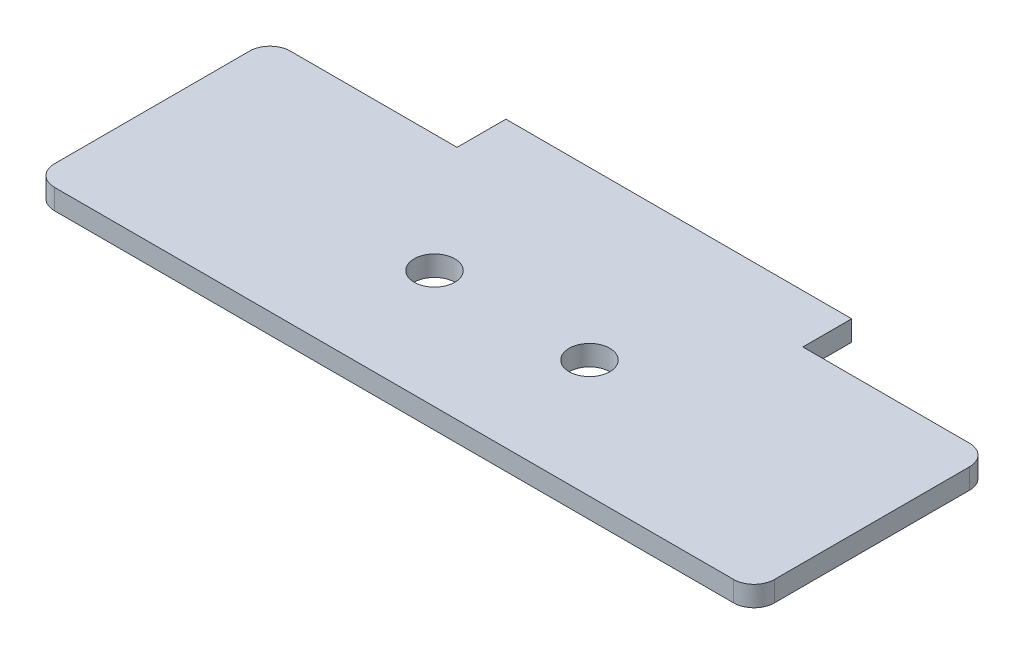
ISO-10303-21;
HEADER;
FILE_DESCRIPTION(('STEP AP214'),'2;1');
FILE_NAME('part.step','',(''),(''),'','','');
FILE_SCHEMA(('AUTOMOTIVE_DESIGN { 1 0 10303 214 1 1 1 1 }'));
ENDSEC;
DATA;
#1=APPLICATION_CONTEXT('core data for automotive mechanical design processes');
#2=APPLICATION_PROTOCOL_DEFINITION('international standard','automotive_design',2000,#1);
#3=PRODUCT_CONTEXT('',#1,'mechanical');
#4=PRODUCT('Part','Part','',(#3));
#5=PRODUCT_RELATED_PRODUCT_CATEGORY('part','',(#4));
#6=PRODUCT_DEFINITION_FORMATION('','',#4);
#7=PRODUCT_DEFINITION_CONTEXT('part definition',#1,'design');
#8=PRODUCT_DEFINITION('design','',#6,#7);
#9=PRODUCT_DEFINITION_SHAPE('','',#8);
#10=(LENGTH_UNIT() NAMED_UNIT(*) SI_UNIT(.MILLI.,.METRE.));
#11=(NAMED_UNIT(*) PLANE_ANGLE_UNIT() SI_UNIT($,.RADIAN.));
#12=(NAMED_UNIT(*) SI_UNIT($,.STERADIAN.) SOLID_ANGLE_UNIT());
#13=UNCERTAINTY_MEASURE_WITH_UNIT(LENGTH_MEASURE(1.E-05),#10,'distance_accuracy_value','');
#14=(GEOMETRIC_REPRESENTATION_CONTEXT(3) GLOBAL_UNCERTAINTY_ASSIGNED_CONTEXT((#13)) GLOBAL_UNIT_ASSIGNED_CONTEXT((#10,
#11,#12)) REPRESENTATION_CONTEXT('',''));
#15=CARTESIAN_POINT('',(0.,0.,0.));
#16=DIRECTION('',(0.,0.,1.));
#17=DIRECTION('',(1.,0.,0.));
#18=AXIS2_PLACEMENT_3D('',#15,#16,#17);
#19=CARTESIAN_POINT('',(-6.44499999999996,0.5,-2.40000000000001));
#20=DIRECTION('',(0.,1.,0.));
#21=DIRECTION('',(0.,0.,1.));
#22=AXIS2_PLACEMENT_3D('',#19,#20,#21);
#23=PLANE('',#22);
#24=CARTESIAN_POINT('',(0.,0.5,0.));
#25=DIRECTION('',(0.,1.,0.));
#26=DIRECTION('',(0.,0.,1.));
#27=AXIS2_PLACEMENT_3D('',#24,#25,#26);
#28=CIRCLE('',#27,0.499999999999999);
#29=CARTESIAN_POINT('',(0.,0.5,0.499999999999985));
#30=VERTEX_POINT('',#29);
#31=EDGE_CURVE('E170',#30,#30,#28,.T.);
#32=ORIENTED_EDGE('',*,*,#31,.F.);
#33=EDGE_LOOP('',(#32));
#34=FACE_BOUND('',#33,.T.);
#35=DIRECTION('',(0.,0.,1.));
#36=VECTOR('',#35,1.);
#37=CARTESIAN_POINT('',(-2.34499999999997,0.5,-4.10000000000001));
#38=LINE('',#37,#36);
#39=CARTESIAN_POINT('',(-2.34499999999997,0.5,-4.10000000000001));
#40=VERTEX_POINT('',#39);
#41=CARTESIAN_POINT('',(-2.34499999999997,0.5,-2.89999999999999));
#42=VERTEX_POINT('',#41);
#43=EDGE_CURVE('E200',#40,#42,#38,.T.);
#44=ORIENTED_EDGE('',*,*,#43,.T.);
#45=DIRECTION('',(-1.,0.,0.));
#46=VECTOR('',#45,1.);
#47=CARTESIAN_POINT('',(-6.44499999999996,0.5,-2.90000000000001));
#48=LINE('',#47,#46);
#49=CARTESIAN_POINT('',(-6.44499999999996,0.5,-2.90000000000001));
#50=VERTEX_POINT('',#49);
#51=EDGE_CURVE('E112',#42,#50,#48,.T.);
#52=ORIENTED_EDGE('',*,*,#51,.T.);
#53=CARTESIAN_POINT('',(-6.44499999999996,0.5,-2.40000000000001));
#54=DIRECTION('',(0.,1.,0.));
#55=DIRECTION('',(0.,0.,1.));
#56=AXIS2_PLACEMENT_3D('',#53,#54,#55);
#57=CIRCLE('',#56,0.5);
#58=CARTESIAN_POINT('',(-6.94499999999996,0.5,-2.40000000000001));
#59=VERTEX_POINT('',#58);
#60=EDGE_CURVE('E237',#50,#59,#57,.T.);
#61=ORIENTED_EDGE('',*,*,#60,.T.);
#62=DIRECTION('',(0.,0.,1.));
#63=VECTOR('',#62,1.);
#64=CARTESIAN_POINT('',(-6.94499999999996,0.5,-2.40000000000001));
#65=LINE('',#64,#63);
#66=CARTESIAN_POINT('',(-6.94499999999996,0.5,2.39999999999998));
#67=VERTEX_POINT('',#66);
#68=EDGE_CURVE('E257',#59,#67,#65,.T.);
#69=ORIENTED_EDGE('',*,*,#68,.T.);
#70=CARTESIAN_POINT('',(-6.44499999999997,0.5,2.39999999999999));
#71=DIRECTION('',(0.,1.,0.));
#72=DIRECTION('',(0.,0.,1.));
#73=AXIS2_PLACEMENT_3D('',#70,#71,#72);
#74=CIRCLE('',#73,0.5);
#75=CARTESIAN_POINT('',(-6.44499999999996,0.5,2.89999999999999));
#76=VERTEX_POINT('',#75);
#77=EDGE_CURVE('E253',#67,#76,#74,.T.);
#78=ORIENTED_EDGE('',*,*,#77,.T.);
#79=DIRECTION('',(1.,0.,0.));
#80=VECTOR('',#79,1.);
#81=CARTESIAN_POINT('',(-6.44499999999996,0.5,2.89999999999999));
#82=LINE('',#81,#80);
#83=CARTESIAN_POINT('',(10.255,0.5,2.89999999999999));
#84=VERTEX_POINT('',#83);
#85=EDGE_CURVE('E256',#76,#84,#82,.T.);
#86=ORIENTED_EDGE('',*,*,#85,.T.);
#87=CARTESIAN_POINT('',(10.255,0.5,2.39999999999999));
#88=DIRECTION('',(0.,1.,0.));
#89=DIRECTION('',(0.,0.,1.));
#90=AXIS2_PLACEMENT_3D('',#87,#88,#89);
#91=CIRCLE('',#90,0.5);
#92=CARTESIAN_POINT('',(10.755,0.5,2.39999999999999));
#93=VERTEX_POINT('',#92);
#94=EDGE_CURVE('E261',#84,#93,#91,.T.);
#95=ORIENTED_EDGE('',*,*,#94,.T.);
#96=DIRECTION('',(0.,0.,-1.));
#97=VECTOR('',#96,1.);
#98=CARTESIAN_POINT('',(10.755,0.5,-2.40000000000001));
#99=LINE('',#98,#97);
#100=CARTESIAN_POINT('',(10.755,0.5,-2.40000000000001));
#101=VERTEX_POINT('',#100);
#102=EDGE_CURVE('E268',#93,#101,#99,.T.);
#103=ORIENTED_EDGE('',*,*,#102,.T.);
#104=CARTESIAN_POINT('',(10.255,0.5,-2.40000000000001));
#105=DIRECTION('',(0.,1.,0.));
#106=DIRECTION('',(0.,0.,-1.));
#107=AXIS2_PLACEMENT_3D('',#104,#105,#106);
#108=CIRCLE('',#107,0.5);
#109=CARTESIAN_POINT('',(10.255,0.5,-2.90000000000001));
#110=VERTEX_POINT('',#109);
#111=EDGE_CURVE('E143',#101,#110,#108,.T.);
#112=ORIENTED_EDGE('',*,*,#111,.T.);
#113=DIRECTION('',(-1.,0.,0.));
#114=VECTOR('',#113,1.);
#115=CARTESIAN_POINT('',(6.15500000000003,0.5,-2.90000000000001));
#116=LINE('',#115,#114);
#117=CARTESIAN_POINT('',(6.15500000000003,0.5,-2.90000000000001));
#118=VERTEX_POINT('',#117);
#119=EDGE_CURVE('E137',#110,#118,#116,.T.);
#120=ORIENTED_EDGE('',*,*,#119,.T.);
#121=DIRECTION('',(0.,0.,-1.));
#122=VECTOR('',#121,1.);
#123=CARTESIAN_POINT('',(6.15500000000003,0.5,-4.10000000000001));
#124=LINE('',#123,#122);
#125=CARTESIAN_POINT('',(6.15500000000003,0.5,-4.10000000000001));
#126=VERTEX_POINT('',#125);
#127=EDGE_CURVE('E141',#118,#126,#124,.T.);
#128=ORIENTED_EDGE('',*,*,#127,.T.);
#129=DIRECTION('',(-1.,0.,0.));
#130=VECTOR('',#129,1.);
#131=CARTESIAN_POINT('',(-2.34499999999997,0.5,-4.10000000000001));
#132=LINE('',#131,#130);
#133=EDGE_CURVE('E57',#126,#40,#132,.T.);
#134=ORIENTED_EDGE('',*,*,#133,.T.);
#135=EDGE_LOOP('',(#44,#52,#61,#69,#78,#86,#95,#103,#112,#120,#128,#134));
#136=FACE_BOUND('',#135,.T.);
#137=CARTESIAN_POINT('',(3.81000000000004,0.5,0.));
#138=DIRECTION('',(0.,1.,0.));
#139=DIRECTION('',(0.,0.,1.));
#140=AXIS2_PLACEMENT_3D('',#137,#138,#139);
#141=CIRCLE('',#140,0.499999999999999);
#142=CARTESIAN_POINT('',(3.81000000000004,0.5,0.499999999999985));
#143=VERTEX_POINT('',#142);
#144=EDGE_CURVE('E312',#143,#143,#141,.T.);
#145=ORIENTED_EDGE('',*,*,#144,.F.);
#146=EDGE_LOOP('',(#145));
#147=FACE_BOUND('',#146,.T.);
#148=ADVANCED_FACE('F39',(#34,#136,#147),#23,.T.);
#149=CARTESIAN_POINT('',(-6.44499999999996,0.,-2.40000000000001));
#150=DIRECTION('',(0.,1.,0.));
#151=DIRECTION('',(0.,0.,1.));
#152=AXIS2_PLACEMENT_3D('',#149,#150,#151);
#153=PLANE('',#152);
#154=DIRECTION('',(0.,0.,1.));
#155=VECTOR('',#154,1.);
#156=CARTESIAN_POINT('',(-2.34499999999997,0.,-4.10000000000001));
#157=LINE('',#156,#155);
#158=CARTESIAN_POINT('',(-2.34499999999997,0.,-4.10000000000001));
#159=VERTEX_POINT('',#158);
#160=CARTESIAN_POINT('',(-2.34499999999997,0.,-2.89999999999999));
#161=VERTEX_POINT('',#160);
#162=EDGE_CURVE('E165',#159,#161,#157,.T.);
#163=ORIENTED_EDGE('',*,*,#162,.F.);
#164=DIRECTION('',(-1.,0.,0.));
#165=VECTOR('',#164,1.);
#166=CARTESIAN_POINT('',(-2.34499999999997,0.,-4.10000000000001));
#167=LINE('',#166,#165);
#168=CARTESIAN_POINT('',(6.15500000000003,0.,-4.10000000000001));
#169=VERTEX_POINT('',#168);
#170=EDGE_CURVE('E104',#169,#159,#167,.T.);
#171=ORIENTED_EDGE('',*,*,#170,.F.);
#172=DIRECTION('',(0.,0.,-1.));
#173=VECTOR('',#172,1.);
#174=CARTESIAN_POINT('',(6.15500000000003,0.,-4.10000000000001));
#175=LINE('',#174,#173);
#176=CARTESIAN_POINT('',(6.15500000000003,0.,-2.90000000000001));
#177=VERTEX_POINT('',#176);
#178=EDGE_CURVE('E98',#177,#169,#175,.T.);
#179=ORIENTED_EDGE('',*,*,#178,.F.);
#180=DIRECTION('',(-1.,0.,0.));
#181=VECTOR('',#180,1.);
#182=CARTESIAN_POINT('',(6.15500000000003,0.,-2.90000000000001));
#183=LINE('',#182,#181);
#184=CARTESIAN_POINT('',(10.255,0.,-2.90000000000001));
#185=VERTEX_POINT('',#184);
#186=EDGE_CURVE('E152',#185,#177,#183,.T.);
#187=ORIENTED_EDGE('',*,*,#186,.F.);
#188=CARTESIAN_POINT('',(10.255,0.,-2.40000000000001));
#189=DIRECTION('',(0.,1.,0.));
#190=DIRECTION('',(0.,0.,-1.));
#191=AXIS2_PLACEMENT_3D('',#188,#189,#190);
#192=CIRCLE('',#191,0.5);
#193=CARTESIAN_POINT('',(10.755,0.,-2.40000000000001));
#194=VERTEX_POINT('',#193);
#195=EDGE_CURVE('E191',#194,#185,#192,.T.);
#196=ORIENTED_EDGE('',*,*,#195,.F.);
#197=DIRECTION('',(0.,0.,-1.));
#198=VECTOR('',#197,1.);
#199=CARTESIAN_POINT('',(10.755,0.,-2.40000000000001));
#200=LINE('',#199,#198);
#201=CARTESIAN_POINT('',(10.755,0.,2.39999999999999));
#202=VERTEX_POINT('',#201);
#203=EDGE_CURVE('E188',#202,#194,#200,.T.);
#204=ORIENTED_EDGE('',*,*,#203,.F.);
#205=CARTESIAN_POINT('',(10.255,0.,2.39999999999999));
#206=DIRECTION('',(0.,1.,0.));
#207=DIRECTION('',(0.,0.,1.));
#208=AXIS2_PLACEMENT_3D('',#205,#206,#207);
#209=CIRCLE('',#208,0.5);
#210=CARTESIAN_POINT('',(10.255,0.,2.89999999999999));
#211=VERTEX_POINT('',#210);
#212=EDGE_CURVE('E185',#211,#202,#209,.T.);
#213=ORIENTED_EDGE('',*,*,#212,.F.);
#214=DIRECTION('',(1.,0.,0.));
#215=VECTOR('',#214,1.);
#216=CARTESIAN_POINT('',(-6.44499999999996,0.,2.89999999999999));
#217=LINE('',#216,#215);
#218=CARTESIAN_POINT('',(-6.44499999999996,0.,2.89999999999999));
#219=VERTEX_POINT('',#218);
#220=EDGE_CURVE('E182',#219,#211,#217,.T.);
#221=ORIENTED_EDGE('',*,*,#220,.F.);
#222=CARTESIAN_POINT('',(-6.44499999999997,0.,2.39999999999999));
#223=DIRECTION('',(0.,1.,0.));
#224=DIRECTION('',(0.,0.,1.));
#225=AXIS2_PLACEMENT_3D('',#222,#223,#224);
#226=CIRCLE('',#225,0.5);
#227=CARTESIAN_POINT('',(-6.94499999999996,0.,2.39999999999998));
#228=VERTEX_POINT('',#227);
#229=EDGE_CURVE('E179',#228,#219,#226,.T.);
#230=ORIENTED_EDGE('',*,*,#229,.F.);
#231=DIRECTION('',(0.,0.,1.));
#232=VECTOR('',#231,1.);
#233=CARTESIAN_POINT('',(-6.94499999999996,0.,-2.40000000000001));
#234=LINE('',#233,#232);
#235=CARTESIAN_POINT('',(-6.94499999999996,0.,-2.40000000000001));
#236=VERTEX_POINT('',#235);
#237=EDGE_CURVE('E176',#236,#228,#234,.T.);
#238=ORIENTED_EDGE('',*,*,#237,.F.);
#239=CARTESIAN_POINT('',(-6.44499999999996,0.,-2.40000000000001));
#240=DIRECTION('',(0.,1.,0.));
#241=DIRECTION('',(0.,0.,1.));
#242=AXIS2_PLACEMENT_3D('',#239,#240,#241);
#243=CIRCLE('',#242,0.5);
#244=CARTESIAN_POINT('',(-6.44499999999996,0.,-2.90000000000001));
#245=VERTEX_POINT('',#244);
#246=EDGE_CURVE('E173',#245,#236,#243,.T.);
#247=ORIENTED_EDGE('',*,*,#246,.F.);
#248=DIRECTION('',(-1.,0.,0.));
#249=VECTOR('',#248,1.);
#250=CARTESIAN_POINT('',(-6.44499999999996,0.,-2.90000000000001));
#251=LINE('',#250,#249);
#252=EDGE_CURVE('E169',#161,#245,#251,.T.);
#253=ORIENTED_EDGE('',*,*,#252,.F.);
#254=EDGE_LOOP('',(#163,#171,#179,#187,#196,#204,#213,#221,#230,#238,#247,#253));
#255=FACE_BOUND('',#254,.T.);
#256=CARTESIAN_POINT('',(0.,0.,0.));
#257=DIRECTION('',(0.,1.,0.));
#258=DIRECTION('',(0.,0.,1.));
#259=AXIS2_PLACEMENT_3D('',#256,#257,#258);
#260=CIRCLE('',#259,0.499999999999999);
#261=CARTESIAN_POINT('',(0.,0.,0.499999999999985));
#262=VERTEX_POINT('',#261);
#263=EDGE_CURVE('E320',#262,#262,#260,.T.);
#264=ORIENTED_EDGE('',*,*,#263,.T.);
#265=EDGE_LOOP('',(#264));
#266=FACE_BOUND('',#265,.T.);
#267=CARTESIAN_POINT('',(3.81000000000004,0.,0.));
#268=DIRECTION('',(0.,1.,0.));
#269=DIRECTION('',(0.,0.,1.));
#270=AXIS2_PLACEMENT_3D('',#267,#268,#269);
#271=CIRCLE('',#270,0.499999999999999);
#272=CARTESIAN_POINT('',(3.81000000000004,0.,0.499999999999985));
#273=VERTEX_POINT('',#272);
#274=EDGE_CURVE('E315',#273,#273,#271,.T.);
#275=ORIENTED_EDGE('',*,*,#274,.T.);
#276=EDGE_LOOP('',(#275));
#277=FACE_BOUND('',#276,.T.);
#278=ADVANCED_FACE('F241',(#255,#266,#277),#153,.F.);
#279=CARTESIAN_POINT('',(-2.34499999999997,0.5,-4.10000000000001));
#280=DIRECTION('',(1.,0.,0.));
#281=DIRECTION('',(0.,0.,-1.));
#282=AXIS2_PLACEMENT_3D('',#279,#280,#281);
#283=PLANE('',#282);
#284=ORIENTED_EDGE('',*,*,#162,.T.);
#285=DIRECTION('',(0.,-1.,0.));
#286=VECTOR('',#285,1.);
#287=CARTESIAN_POINT('',(-2.34499999999997,0.5,-2.89999999999999));
#288=LINE('',#287,#286);
#289=EDGE_CURVE('E11',#42,#161,#288,.T.);
#290=ORIENTED_EDGE('',*,*,#289,.F.);
#291=ORIENTED_EDGE('',*,*,#43,.F.);
#292=DIRECTION('',(0.,-1.,0.));
#293=VECTOR('',#292,1.);
#294=CARTESIAN_POINT('',(-2.34499999999997,0.5,-4.10000000000001));
#295=LINE('',#294,#293);
#296=EDGE_CURVE('E161',#40,#159,#295,.T.);
#297=ORIENTED_EDGE('',*,*,#296,.T.);
#298=EDGE_LOOP('',(#284,#290,#291,#297));
#299=FACE_BOUND('',#298,.T.);
#300=ADVANCED_FACE('F41',(#299),#283,.F.);
#301=CARTESIAN_POINT('',(-6.44499999999996,0.5,-2.90000000000001));
#302=DIRECTION('',(0.,0.,1.));
#303=DIRECTION('',(1.,0.,0.));
#304=AXIS2_PLACEMENT_3D('',#301,#302,#303);
#305=PLANE('',#304);
#306=ORIENTED_EDGE('',*,*,#252,.T.);
#307=DIRECTION('',(0.,-1.,0.));
#308=VECTOR('',#307,1.);
#309=CARTESIAN_POINT('',(-6.44499999999996,0.5,-2.90000000000001));
#310=LINE('',#309,#308);
#311=EDGE_CURVE('E49',#50,#245,#310,.T.);
#312=ORIENTED_EDGE('',*,*,#311,.F.);
#313=ORIENTED_EDGE('',*,*,#51,.F.);
#314=ORIENTED_EDGE('',*,*,#289,.T.);
#315=EDGE_LOOP('',(#306,#312,#313,#314));
#316=FACE_BOUND('',#315,.T.);
#317=ADVANCED_FACE('F418',(#316),#305,.F.);
#318=CARTESIAN_POINT('',(-6.44499999999996,0.5,-2.40000000000001));
#319=DIRECTION('',(0.,-1.,0.));
#320=DIRECTION('',(0.,0.,-1.));
#321=AXIS2_PLACEMENT_3D('',#318,#319,#320);
#322=CYLINDRICAL_SURFACE('',#321,0.5);
#323=ORIENTED_EDGE('',*,*,#246,.T.);
#324=DIRECTION('',(0.,-1.,0.));
#325=VECTOR('',#324,1.);
#326=CARTESIAN_POINT('',(-6.94499999999996,0.5,-2.40000000000001));
#327=LINE('',#326,#325);
#328=EDGE_CURVE('E227',#59,#236,#327,.T.);
#329=ORIENTED_EDGE('',*,*,#328,.F.);
#330=ORIENTED_EDGE('',*,*,#60,.F.);
#331=ORIENTED_EDGE('',*,*,#311,.T.);
#332=EDGE_LOOP('',(#323,#329,#330,#331));
#333=FACE_BOUND('',#332,.T.);
#334=ADVANCED_FACE('F235',(#333),#322,.T.);
#335=CARTESIAN_POINT('',(-6.94499999999996,0.5,-2.40000000000001));
#336=DIRECTION('',(1.,0.,0.));
#337=DIRECTION('',(0.,0.,-1.));
#338=AXIS2_PLACEMENT_3D('',#335,#336,#337);
#339=PLANE('',#338);
#340=ORIENTED_EDGE('',*,*,#237,.T.);
#341=DIRECTION('',(0.,-1.,0.));
#342=VECTOR('',#341,1.);
#343=CARTESIAN_POINT('',(-6.94499999999996,0.5,2.39999999999998));
#344=LINE('',#343,#342);
#345=EDGE_CURVE('E223',#67,#228,#344,.T.);
#346=ORIENTED_EDGE('',*,*,#345,.F.);
#347=ORIENTED_EDGE('',*,*,#68,.F.);
#348=ORIENTED_EDGE('',*,*,#328,.T.);
#349=EDGE_LOOP('',(#340,#346,#347,#348));
#350=FACE_BOUND('',#349,.T.);
#351=ADVANCED_FACE('F247',(#350),#339,.F.);
#352=CARTESIAN_POINT('',(-6.44499999999997,0.5,2.39999999999999));
#353=DIRECTION('',(0.,-1.,0.));
#354=DIRECTION('',(0.,0.,-1.));
#355=AXIS2_PLACEMENT_3D('',#352,#353,#354);
#356=CYLINDRICAL_SURFACE('',#355,0.5);
#357=ORIENTED_EDGE('',*,*,#229,.T.);
#358=DIRECTION('',(0.,-1.,0.));
#359=VECTOR('',#358,1.);
#360=CARTESIAN_POINT('',(-6.44499999999996,0.5,2.89999999999999));
#361=LINE('',#360,#359);
#362=EDGE_CURVE('E219',#76,#219,#361,.T.);
#363=ORIENTED_EDGE('',*,*,#362,.F.);
#364=ORIENTED_EDGE('',*,*,#77,.F.);
#365=ORIENTED_EDGE('',*,*,#345,.T.);
#366=EDGE_LOOP('',(#357,#363,#364,#365));
#367=FACE_BOUND('',#366,.T.);
#368=ADVANCED_FACE('F251',(#367),#356,.T.);
#369=CARTESIAN_POINT('',(-6.44499999999996,0.5,2.89999999999999));
#370=DIRECTION('',(0.,0.,-1.));
#371=DIRECTION('',(-1.,0.,0.));
#372=AXIS2_PLACEMENT_3D('',#369,#370,#371);
#373=PLANE('',#372);
#374=ORIENTED_EDGE('',*,*,#220,.T.);
#375=DIRECTION('',(0.,-1.,0.));
#376=VECTOR('',#375,1.);
#377=CARTESIAN_POINT('',(10.255,0.5,2.89999999999999));
#378=LINE('',#377,#376);
#379=EDGE_CURVE('E215',#84,#211,#378,.T.);
#380=ORIENTED_EDGE('',*,*,#379,.F.);
#381=ORIENTED_EDGE('',*,*,#85,.F.);
#382=ORIENTED_EDGE('',*,*,#362,.T.);
#383=EDGE_LOOP('',(#374,#380,#381,#382));
#384=FACE_BOUND('',#383,.T.);
#385=ADVANCED_FACE('F383',(#384),#373,.F.);
#386=CARTESIAN_POINT('',(10.255,0.5,2.39999999999999));
#387=DIRECTION('',(0.,-1.,0.));
#388=DIRECTION('',(0.,0.,-1.));
#389=AXIS2_PLACEMENT_3D('',#386,#387,#388);
#390=CYLINDRICAL_SURFACE('',#389,0.5);
#391=ORIENTED_EDGE('',*,*,#212,.T.);
#392=DIRECTION('',(0.,-1.,0.));
#393=VECTOR('',#392,1.);
#394=CARTESIAN_POINT('',(10.755,0.5,2.39999999999999));
#395=LINE('',#394,#393);
#396=EDGE_CURVE('E211',#93,#202,#395,.T.);
#397=ORIENTED_EDGE('',*,*,#396,.F.);
#398=ORIENTED_EDGE('',*,*,#94,.F.);
#399=ORIENTED_EDGE('',*,*,#379,.T.);
#400=EDGE_LOOP('',(#391,#397,#398,#399));
#401=FACE_BOUND('',#400,.T.);
#402=ADVANCED_FACE('F374',(#401),#390,.T.);
#403=CARTESIAN_POINT('',(10.755,0.5,-2.40000000000001));
#404=DIRECTION('',(-1.,0.,0.));
#405=DIRECTION('',(0.,0.,1.));
#406=AXIS2_PLACEMENT_3D('',#403,#404,#405);
#407=PLANE('',#406);
#408=ORIENTED_EDGE('',*,*,#203,.T.);
#409=DIRECTION('',(0.,-1.,0.));
#410=VECTOR('',#409,1.);
#411=CARTESIAN_POINT('',(10.755,0.5,-2.40000000000001));
#412=LINE('',#411,#410);
#413=EDGE_CURVE('E207',#101,#194,#412,.T.);
#414=ORIENTED_EDGE('',*,*,#413,.F.);
#415=ORIENTED_EDGE('',*,*,#102,.F.);
#416=ORIENTED_EDGE('',*,*,#396,.T.);
#417=EDGE_LOOP('',(#408,#414,#415,#416));
#418=FACE_BOUND('',#417,.T.);
#419=ADVANCED_FACE('F276',(#418),#407,.F.);
#420=CARTESIAN_POINT('',(10.255,0.5,-2.40000000000001));
#421=DIRECTION('',(0.,-1.,0.));
#422=DIRECTION('',(0.,0.,-1.));
#423=AXIS2_PLACEMENT_3D('',#420,#421,#422);
#424=CYLINDRICAL_SURFACE('',#423,0.5);
#425=ORIENTED_EDGE('',*,*,#195,.T.);
#426=DIRECTION('',(0.,-1.,0.));
#427=VECTOR('',#426,1.);
#428=CARTESIAN_POINT('',(10.255,0.5,-2.90000000000001));
#429=LINE('',#428,#427);
#430=EDGE_CURVE('E154',#110,#185,#429,.T.);
#431=ORIENTED_EDGE('',*,*,#430,.F.);
#432=ORIENTED_EDGE('',*,*,#111,.F.);
#433=ORIENTED_EDGE('',*,*,#413,.T.);
#434=EDGE_LOOP('',(#425,#431,#432,#433));
#435=FACE_BOUND('',#434,.T.);
#436=ADVANCED_FACE('F280',(#435),#424,.T.);
#437=CARTESIAN_POINT('',(6.15500000000003,0.5,-2.90000000000001));
#438=DIRECTION('',(0.,0.,1.));
#439=DIRECTION('',(1.,0.,0.));
#440=AXIS2_PLACEMENT_3D('',#437,#438,#439);
#441=PLANE('',#440);
#442=ORIENTED_EDGE('',*,*,#186,.T.);
#443=DIRECTION('',(0.,-1.,0.));
#444=VECTOR('',#443,1.);
#445=CARTESIAN_POINT('',(6.15500000000003,0.5,-2.90000000000001));
#446=LINE('',#445,#444);
#447=EDGE_CURVE('E149',#118,#177,#446,.T.);
#448=ORIENTED_EDGE('',*,*,#447,.F.);
#449=ORIENTED_EDGE('',*,*,#119,.F.);
#450=ORIENTED_EDGE('',*,*,#430,.T.);
#451=EDGE_LOOP('',(#442,#448,#449,#450));
#452=FACE_BOUND('',#451,.T.);
#453=ADVANCED_FACE('F150',(#452),#441,.F.);
#454=CARTESIAN_POINT('',(6.15500000000003,0.5,-4.10000000000001));
#455=DIRECTION('',(-1.,0.,0.));
#456=DIRECTION('',(0.,0.,1.));
#457=AXIS2_PLACEMENT_3D('',#454,#455,#456);
#458=PLANE('',#457);
#459=ORIENTED_EDGE('',*,*,#178,.T.);
#460=DIRECTION('',(0.,-1.,0.));
#461=VECTOR('',#460,1.);
#462=CARTESIAN_POINT('',(6.15500000000003,0.5,-4.10000000000001));
#463=LINE('',#462,#461);
#464=EDGE_CURVE('E155',#126,#169,#463,.T.);
#465=ORIENTED_EDGE('',*,*,#464,.F.);
#466=ORIENTED_EDGE('',*,*,#127,.F.);
#467=ORIENTED_EDGE('',*,*,#447,.T.);
#468=EDGE_LOOP('',(#459,#465,#466,#467));
#469=FACE_BOUND('',#468,.T.);
#470=ADVANCED_FACE('F157',(#469),#458,.F.);
#471=CARTESIAN_POINT('',(-2.34499999999997,0.5,-4.10000000000001));
#472=DIRECTION('',(0.,0.,1.));
#473=DIRECTION('',(1.,0.,0.));
#474=AXIS2_PLACEMENT_3D('',#471,#472,#473);
#475=PLANE('',#474);
#476=ORIENTED_EDGE('',*,*,#170,.T.);
#477=ORIENTED_EDGE('',*,*,#296,.F.);
#478=ORIENTED_EDGE('',*,*,#133,.F.);
#479=ORIENTED_EDGE('',*,*,#464,.T.);
#480=EDGE_LOOP('',(#476,#477,#478,#479));
#481=FACE_BOUND('',#480,.T.);
#482=ADVANCED_FACE('F284',(#481),#475,.F.);
#483=CARTESIAN_POINT('',(0.,0.5,0.));
#484=DIRECTION('',(0.,-1.,0.));
#485=DIRECTION('',(0.,0.,-1.));
#486=AXIS2_PLACEMENT_3D('',#483,#484,#485);
#487=CYLINDRICAL_SURFACE('',#486,0.499999999999999);
#488=ORIENTED_EDGE('',*,*,#31,.T.);
#489=EDGE_LOOP('',(#488));
#490=FACE_BOUND('',#489,.T.);
#491=ORIENTED_EDGE('',*,*,#263,.F.);
#492=EDGE_LOOP('',(#491));
#493=FACE_BOUND('',#492,.T.);
#494=ADVANCED_FACE('F286',(#490,#493),#487,.F.);
#495=CARTESIAN_POINT('',(3.81000000000004,0.5,0.));
#496=DIRECTION('',(0.,-1.,0.));
#497=DIRECTION('',(0.,0.,-1.));
#498=AXIS2_PLACEMENT_3D('',#495,#496,#497);
#499=CYLINDRICAL_SURFACE('',#498,0.499999999999999);
#500=ORIENTED_EDGE('',*,*,#144,.T.);
#501=EDGE_LOOP('',(#500));
#502=FACE_BOUND('',#501,.T.);
#503=ORIENTED_EDGE('',*,*,#274,.F.);
#504=EDGE_LOOP('',(#503));
#505=FACE_BOUND('',#504,.T.);
#506=ADVANCED_FACE('F292',(#502,#505),#499,.F.);
#507=CLOSED_SHELL('',(#148,#278,#300,#317,#334,#351,#368,#385,#402,#419,#436,#453,#470,#482,
#494,#506));
#508=MANIFOLD_SOLID_BREP('B2',#507);
#509=ADVANCED_BREP_SHAPE_REPRESENTATION('',(#18,#508),#14);
#510=SHAPE_DEFINITION_REPRESENTATION(#9,#509);
ENDSEC;
END-ISO-10303-21;
